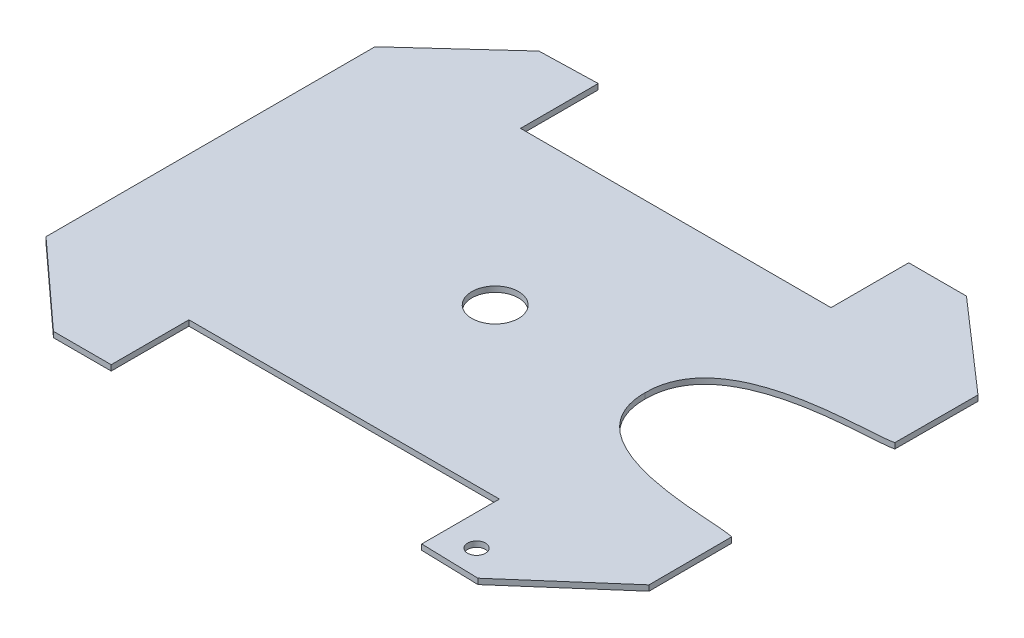
ISO-10303-21;
HEADER;
FILE_DESCRIPTION(('STEP AP214'),'2;1');
FILE_NAME('part.step','',(''),(''),'','','');
FILE_SCHEMA(('AUTOMOTIVE_DESIGN { 1 0 10303 214 1 1 1 1 }'));
ENDSEC;
DATA;
#1=APPLICATION_CONTEXT('core data for automotive mechanical design processes');
#2=APPLICATION_PROTOCOL_DEFINITION('international standard','automotive_design',2000,#1);
#3=PRODUCT_CONTEXT('',#1,'mechanical');
#4=PRODUCT('Part','Part','',(#3));
#5=PRODUCT_RELATED_PRODUCT_CATEGORY('part','',(#4));
#6=PRODUCT_DEFINITION_FORMATION('','',#4);
#7=PRODUCT_DEFINITION_CONTEXT('part definition',#1,'design');
#8=PRODUCT_DEFINITION('design','',#6,#7);
#9=PRODUCT_DEFINITION_SHAPE('','',#8);
#10=(LENGTH_UNIT() NAMED_UNIT(*) SI_UNIT(.MILLI.,.METRE.));
#11=(NAMED_UNIT(*) PLANE_ANGLE_UNIT() SI_UNIT($,.RADIAN.));
#12=(NAMED_UNIT(*) SI_UNIT($,.STERADIAN.) SOLID_ANGLE_UNIT());
#13=UNCERTAINTY_MEASURE_WITH_UNIT(LENGTH_MEASURE(1.E-05),#10,'distance_accuracy_value','');
#14=(GEOMETRIC_REPRESENTATION_CONTEXT(3) GLOBAL_UNCERTAINTY_ASSIGNED_CONTEXT((#13)) GLOBAL_UNIT_ASSIGNED_CONTEXT((#10,
#11,#12)) REPRESENTATION_CONTEXT('',''));
#15=CARTESIAN_POINT('',(0.,0.,0.));
#16=DIRECTION('',(0.,0.,1.));
#17=DIRECTION('',(1.,0.,0.));
#18=AXIS2_PLACEMENT_3D('',#15,#16,#17);
#19=CARTESIAN_POINT('',(273.101729513809,5.,148.382005757265));
#20=CARTESIAN_POINT('',(253.05619370493,5.,142.743081174435));
#21=CARTESIAN_POINT('',(121.230792792244,5.,151.614484767043));
#22=CARTESIAN_POINT('',(121.662419816864,5.,74.8747182026434));
#23=B_SPLINE_CURVE_WITH_KNOTS('',3,(#19,#20,#21,#22),.UNSPECIFIED.,.F.,.F.,(4,4),(0.,1.),.UNSPECIFIED.);
#24=DIRECTION('',(0.,-1.,0.));
#25=VECTOR('',#24,1.);
#26=SURFACE_OF_LINEAR_EXTRUSION('',#23,#25);
#27=CARTESIAN_POINT('',(273.101729513809,0.,148.382005757265));
#28=CARTESIAN_POINT('',(253.05619370493,0.,142.743081174435));
#29=CARTESIAN_POINT('',(121.230792792244,0.,151.614484767043));
#30=CARTESIAN_POINT('',(121.662419816864,0.,74.8747182026434));
#31=B_SPLINE_CURVE_WITH_KNOTS('',3,(#27,#28,#29,#30),.UNSPECIFIED.,.F.,.F.,(4,4),(0.,1.),.UNSPECIFIED.);
#32=CARTESIAN_POINT('',(273.101729513809,0.,148.382005757266));
#33=VERTEX_POINT('',#32);
#34=CARTESIAN_POINT('',(121.662419816864,0.,74.8747182026438));
#35=VERTEX_POINT('',#34);
#36=EDGE_CURVE('E196',#33,#35,#31,.T.);
#37=ORIENTED_EDGE('',*,*,#36,.T.);
#38=DIRECTION('',(0.,-1.,0.));
#39=VECTOR('',#38,1.);
#40=CARTESIAN_POINT('',(121.662419816864,5.,74.8747182026438));
#41=LINE('',#40,#39);
#42=CARTESIAN_POINT('',(121.662419816864,5.,74.8747182026438));
#43=VERTEX_POINT('',#42);
#44=EDGE_CURVE('E11',#43,#35,#41,.T.);
#45=ORIENTED_EDGE('',*,*,#44,.F.);
#46=CARTESIAN_POINT('',(273.101729513809,5.,148.382005757266));
#47=VERTEX_POINT('',#46);
#48=EDGE_CURVE('E243',#47,#43,#23,.T.);
#49=ORIENTED_EDGE('',*,*,#48,.F.);
#50=DIRECTION('',(0.,-1.,0.));
#51=VECTOR('',#50,1.);
#52=CARTESIAN_POINT('',(273.101729513809,5.,148.382005757266));
#53=LINE('',#52,#51);
#54=EDGE_CURVE('E192',#47,#33,#53,.T.);
#55=ORIENTED_EDGE('',*,*,#54,.T.);
#56=EDGE_LOOP('',(#37,#45,#49,#55));
#57=FACE_BOUND('',#56,.T.);
#58=ADVANCED_FACE('F33',(#57),#26,.F.);
#59=CARTESIAN_POINT('',(121.662419816864,5.,74.8747182026438));
#60=CARTESIAN_POINT('',(121.230792792244,5.,-1.86504836175567));
#61=CARTESIAN_POINT('',(253.05619370493,5.,7.00635523085229));
#62=CARTESIAN_POINT('',(273.101729513809,5.,1.36743064802208));
#63=B_SPLINE_CURVE_WITH_KNOTS('',3,(#59,#60,#61,#62),.UNSPECIFIED.,.F.,.F.,(4,4),(0.,1.),.UNSPECIFIED.);
#64=DIRECTION('',(0.,-1.,0.));
#65=VECTOR('',#64,1.);
#66=SURFACE_OF_LINEAR_EXTRUSION('',#63,#65);
#67=CARTESIAN_POINT('',(121.662419816864,0.,74.8747182026438));
#68=CARTESIAN_POINT('',(121.230792792244,0.,-1.86504836175567));
#69=CARTESIAN_POINT('',(253.05619370493,0.,7.00635523085229));
#70=CARTESIAN_POINT('',(273.101729513809,0.,1.36743064802208));
#71=B_SPLINE_CURVE_WITH_KNOTS('',3,(#67,#68,#69,#70),.UNSPECIFIED.,.F.,.F.,(4,4),(0.,1.),.UNSPECIFIED.);
#72=CARTESIAN_POINT('',(273.101729513809,0.,1.36743064802208));
#73=VERTEX_POINT('',#72);
#74=EDGE_CURVE('E201',#35,#73,#71,.T.);
#75=ORIENTED_EDGE('',*,*,#74,.T.);
#76=DIRECTION('',(0.,-1.,0.));
#77=VECTOR('',#76,1.);
#78=CARTESIAN_POINT('',(273.101729513809,5.,1.36743064802208));
#79=LINE('',#78,#77);
#80=CARTESIAN_POINT('',(273.101729513809,5.,1.36743064802208));
#81=VERTEX_POINT('',#80);
#82=EDGE_CURVE('E42',#81,#73,#79,.T.);
#83=ORIENTED_EDGE('',*,*,#82,.F.);
#84=EDGE_CURVE('E126',#43,#81,#63,.T.);
#85=ORIENTED_EDGE('',*,*,#84,.F.);
#86=ORIENTED_EDGE('',*,*,#44,.T.);
#87=EDGE_LOOP('',(#75,#83,#85,#86));
#88=FACE_BOUND('',#87,.T.);
#89=ADVANCED_FACE('F357',(#88),#66,.F.);
#90=CARTESIAN_POINT('',(273.341577688739,5.,-73.2625755728206));
#91=DIRECTION('',(-0.999994835687422,0.,-0.0032138136980613));
#92=DIRECTION('',(-0.0032138136980613,0.,0.999994835687422));
#93=AXIS2_PLACEMENT_3D('',#90,#91,#92);
#94=PLANE('',#93);
#95=DIRECTION('',(0.0032138136980613,0.,-0.999994835687422));
#96=VECTOR('',#95,1.);
#97=CARTESIAN_POINT('',(273.341577688739,0.,-73.2625755728206));
#98=LINE('',#97,#96);
#99=CARTESIAN_POINT('',(273.341577688739,0.,-73.2625755728206));
#100=VERTEX_POINT('',#99);
#101=EDGE_CURVE('E209',#73,#100,#98,.T.);
#102=ORIENTED_EDGE('',*,*,#101,.T.);
#103=DIRECTION('',(0.,-1.,0.));
#104=VECTOR('',#103,1.);
#105=CARTESIAN_POINT('',(273.341577688739,5.,-73.2625755728206));
#106=LINE('',#105,#104);
#107=CARTESIAN_POINT('',(273.341577688739,5.,-73.2625755728206));
#108=VERTEX_POINT('',#107);
#109=EDGE_CURVE('E283',#108,#100,#106,.T.);
#110=ORIENTED_EDGE('',*,*,#109,.F.);
#111=DIRECTION('',(0.0032138136980613,0.,-0.999994835687422));
#112=VECTOR('',#111,1.);
#113=CARTESIAN_POINT('',(273.341577688739,5.,-73.2625755728206));
#114=LINE('',#113,#112);
#115=EDGE_CURVE('E291',#81,#108,#114,.T.);
#116=ORIENTED_EDGE('',*,*,#115,.F.);
#117=ORIENTED_EDGE('',*,*,#82,.T.);
#118=EDGE_LOOP('',(#102,#110,#116,#117));
#119=FACE_BOUND('',#118,.T.);
#120=ADVANCED_FACE('F289',(#119),#94,.F.);
#121=CARTESIAN_POINT('',(273.341577688739,5.,-73.2625755728206));
#122=DIRECTION('',(-0.657933153115814,0.,0.753076334796867));
#123=DIRECTION('',(0.753076334796867,0.,0.657933153115814));
#124=AXIS2_PLACEMENT_3D('',#121,#122,#123);
#125=PLANE('',#124);
#126=DIRECTION('',(-0.753076334796867,0.,-0.657933153115814));
#127=VECTOR('',#126,1.);
#128=CARTESIAN_POINT('',(273.341577688739,0.,-73.2625755728206));
#129=LINE('',#128,#127);
#130=CARTESIAN_POINT('',(191.068300868454,0.,-145.141499307877));
#131=VERTEX_POINT('',#130);
#132=EDGE_CURVE('E214',#100,#131,#129,.T.);
#133=ORIENTED_EDGE('',*,*,#132,.T.);
#134=DIRECTION('',(0.,-1.,0.));
#135=VECTOR('',#134,1.);
#136=CARTESIAN_POINT('',(191.068300868454,5.,-145.141499307877));
#137=LINE('',#136,#135);
#138=CARTESIAN_POINT('',(191.068300868454,5.,-145.141499307877));
#139=VERTEX_POINT('',#138);
#140=EDGE_CURVE('E280',#139,#131,#137,.T.);
#141=ORIENTED_EDGE('',*,*,#140,.F.);
#142=DIRECTION('',(-0.753076334796867,0.,-0.657933153115814));
#143=VECTOR('',#142,1.);
#144=CARTESIAN_POINT('',(273.341577688739,5.,-73.2625755728206));
#145=LINE('',#144,#143);
#146=EDGE_CURVE('E309',#108,#139,#145,.T.);
#147=ORIENTED_EDGE('',*,*,#146,.F.);
#148=ORIENTED_EDGE('',*,*,#109,.T.);
#149=EDGE_LOOP('',(#133,#141,#147,#148));
#150=FACE_BOUND('',#149,.T.);
#151=ADVANCED_FACE('F300',(#150),#125,.F.);
#152=CARTESIAN_POINT('',(139.068300868454,5.,-145.141499307877));
#153=DIRECTION('',(0.,0.,1.));
#154=DIRECTION('',(1.,0.,0.));
#155=AXIS2_PLACEMENT_3D('',#152,#153,#154);
#156=PLANE('',#155);
#157=DIRECTION('',(-1.,0.,0.));
#158=VECTOR('',#157,1.);
#159=CARTESIAN_POINT('',(139.068300868454,0.,-145.141499307877));
#160=LINE('',#159,#158);
#161=CARTESIAN_POINT('',(139.068300868454,0.,-145.141499307877));
#162=VERTEX_POINT('',#161);
#163=EDGE_CURVE('E216',#131,#162,#160,.T.);
#164=ORIENTED_EDGE('',*,*,#163,.T.);
#165=DIRECTION('',(0.,-1.,0.));
#166=VECTOR('',#165,1.);
#167=CARTESIAN_POINT('',(139.068300868454,5.,-145.141499307877));
#168=LINE('',#167,#166);
#169=CARTESIAN_POINT('',(139.068300868454,5.,-145.141499307877));
#170=VERTEX_POINT('',#169);
#171=EDGE_CURVE('E277',#170,#162,#168,.T.);
#172=ORIENTED_EDGE('',*,*,#171,.F.);
#173=DIRECTION('',(-1.,0.,0.));
#174=VECTOR('',#173,1.);
#175=CARTESIAN_POINT('',(139.068300868454,5.,-145.141499307877));
#176=LINE('',#175,#174);
#177=EDGE_CURVE('E306',#139,#170,#176,.T.);
#178=ORIENTED_EDGE('',*,*,#177,.F.);
#179=ORIENTED_EDGE('',*,*,#140,.T.);
#180=EDGE_LOOP('',(#164,#172,#178,#179));
#181=FACE_BOUND('',#180,.T.);
#182=ADVANCED_FACE('F304',(#181),#156,.F.);
#183=CARTESIAN_POINT('',(139.068300868454,5.,-75.1414993078773));
#184=DIRECTION('',(1.,0.,0.));
#185=DIRECTION('',(0.,0.,-1.));
#186=AXIS2_PLACEMENT_3D('',#183,#184,#185);
#187=PLANE('',#186);
#188=DIRECTION('',(0.,0.,1.));
#189=VECTOR('',#188,1.);
#190=CARTESIAN_POINT('',(139.068300868454,0.,-75.1414993078773));
#191=LINE('',#190,#189);
#192=CARTESIAN_POINT('',(139.068300868454,0.,-75.1414993078773));
#193=VERTEX_POINT('',#192);
#194=EDGE_CURVE('E218',#162,#193,#191,.T.);
#195=ORIENTED_EDGE('',*,*,#194,.T.);
#196=DIRECTION('',(0.,-1.,0.));
#197=VECTOR('',#196,1.);
#198=CARTESIAN_POINT('',(139.068300868454,5.,-75.1414993078773));
#199=LINE('',#198,#197);
#200=CARTESIAN_POINT('',(139.068300868454,5.,-75.1414993078773));
#201=VERTEX_POINT('',#200);
#202=EDGE_CURVE('E274',#201,#193,#199,.T.);
#203=ORIENTED_EDGE('',*,*,#202,.F.);
#204=DIRECTION('',(0.,0.,1.));
#205=VECTOR('',#204,1.);
#206=CARTESIAN_POINT('',(139.068300868454,5.,-75.1414993078773));
#207=LINE('',#206,#205);
#208=EDGE_CURVE('E308',#170,#201,#207,.T.);
#209=ORIENTED_EDGE('',*,*,#208,.F.);
#210=ORIENTED_EDGE('',*,*,#171,.T.);
#211=EDGE_LOOP('',(#195,#203,#209,#210));
#212=FACE_BOUND('',#211,.T.);
#213=ADVANCED_FACE('F536',(#212),#187,.F.);
#214=CARTESIAN_POINT('',(-140.586469874335,5.,-75.1414993078773));
#215=DIRECTION('',(0.,0.,1.));
#216=DIRECTION('',(1.,0.,0.));
#217=AXIS2_PLACEMENT_3D('',#214,#215,#216);
#218=PLANE('',#217);
#219=DIRECTION('',(-1.,0.,0.));
#220=VECTOR('',#219,1.);
#221=CARTESIAN_POINT('',(-140.586469874335,0.,-75.1414993078773));
#222=LINE('',#221,#220);
#223=CARTESIAN_POINT('',(-140.586469874335,0.,-75.1414993078773));
#224=VERTEX_POINT('',#223);
#225=EDGE_CURVE('E220',#193,#224,#222,.T.);
#226=ORIENTED_EDGE('',*,*,#225,.T.);
#227=DIRECTION('',(0.,-1.,0.));
#228=VECTOR('',#227,1.);
#229=CARTESIAN_POINT('',(-140.586469874335,5.,-75.1414993078773));
#230=LINE('',#229,#228);
#231=CARTESIAN_POINT('',(-140.586469874335,5.,-75.1414993078773));
#232=VERTEX_POINT('',#231);
#233=EDGE_CURVE('E271',#232,#224,#230,.T.);
#234=ORIENTED_EDGE('',*,*,#233,.F.);
#235=DIRECTION('',(-1.,0.,0.));
#236=VECTOR('',#235,1.);
#237=CARTESIAN_POINT('',(-140.586469874335,5.,-75.1414993078773));
#238=LINE('',#237,#236);
#239=EDGE_CURVE('E311',#201,#232,#238,.T.);
#240=ORIENTED_EDGE('',*,*,#239,.F.);
#241=ORIENTED_EDGE('',*,*,#202,.T.);
#242=EDGE_LOOP('',(#226,#234,#240,#241));
#243=FACE_BOUND('',#242,.T.);
#244=ADVANCED_FACE('F526',(#243),#218,.F.);
#245=CARTESIAN_POINT('',(-140.586469874335,5.,-75.1414993078773));
#246=DIRECTION('',(-1.,0.,0.));
#247=DIRECTION('',(0.,0.,1.));
#248=AXIS2_PLACEMENT_3D('',#245,#246,#247);
#249=PLANE('',#248);
#250=DIRECTION('',(0.,0.,-1.));
#251=VECTOR('',#250,1.);
#252=CARTESIAN_POINT('',(-140.586469874335,0.,-75.1414993078773));
#253=LINE('',#252,#251);
#254=CARTESIAN_POINT('',(-140.586469874335,0.,-145.141499307877));
#255=VERTEX_POINT('',#254);
#256=EDGE_CURVE('E222',#224,#255,#253,.T.);
#257=ORIENTED_EDGE('',*,*,#256,.T.);
#258=DIRECTION('',(0.,-1.,0.));
#259=VECTOR('',#258,1.);
#260=CARTESIAN_POINT('',(-140.586469874335,5.,-145.141499307877));
#261=LINE('',#260,#259);
#262=CARTESIAN_POINT('',(-140.586469874335,5.,-145.141499307877));
#263=VERTEX_POINT('',#262);
#264=EDGE_CURVE('E268',#263,#255,#261,.T.);
#265=ORIENTED_EDGE('',*,*,#264,.F.);
#266=DIRECTION('',(0.,0.,-1.));
#267=VECTOR('',#266,1.);
#268=CARTESIAN_POINT('',(-140.586469874335,5.,-75.1414993078773));
#269=LINE('',#268,#267);
#270=EDGE_CURVE('E317',#232,#263,#269,.T.);
#271=ORIENTED_EDGE('',*,*,#270,.F.);
#272=ORIENTED_EDGE('',*,*,#233,.T.);
#273=EDGE_LOOP('',(#257,#265,#271,#272));
#274=FACE_BOUND('',#273,.T.);
#275=ADVANCED_FACE('F516',(#274),#249,.F.);
#276=CARTESIAN_POINT('',(-140.586469874335,5.,-145.141499307877));
#277=DIRECTION('',(0.026876926913342,0.,0.99963875014912));
#278=DIRECTION('',(0.99963875014912,0.,-0.026876926913342));
#279=AXIS2_PLACEMENT_3D('',#276,#277,#278);
#280=PLANE('',#279);
#281=DIRECTION('',(-0.99963875014912,0.,0.0268769269133419));
#282=VECTOR('',#281,1.);
#283=CARTESIAN_POINT('',(-140.586469874335,0.,-145.141499307877));
#284=LINE('',#283,#282);
#285=CARTESIAN_POINT('',(-192.586469874335,0.,-143.743394043065));
#286=VERTEX_POINT('',#285);
#287=EDGE_CURVE('E224',#255,#286,#284,.T.);
#288=ORIENTED_EDGE('',*,*,#287,.T.);
#289=DIRECTION('',(0.,-1.,0.));
#290=VECTOR('',#289,1.);
#291=CARTESIAN_POINT('',(-192.586469874335,5.,-143.743394043065));
#292=LINE('',#291,#290);
#293=CARTESIAN_POINT('',(-192.586469874335,5.,-143.743394043065));
#294=VERTEX_POINT('',#293);
#295=EDGE_CURVE('E265',#294,#286,#292,.T.);
#296=ORIENTED_EDGE('',*,*,#295,.F.);
#297=DIRECTION('',(-0.99963875014912,0.,0.0268769269133419));
#298=VECTOR('',#297,1.);
#299=CARTESIAN_POINT('',(-140.586469874335,5.,-145.141499307877));
#300=LINE('',#299,#298);
#301=EDGE_CURVE('E319',#263,#294,#300,.T.);
#302=ORIENTED_EDGE('',*,*,#301,.F.);
#303=ORIENTED_EDGE('',*,*,#264,.T.);
#304=EDGE_LOOP('',(#288,#296,#302,#303));
#305=FACE_BOUND('',#304,.T.);
#306=ADVANCED_FACE('F506',(#305),#280,.F.);
#307=CARTESIAN_POINT('',(-269.792181600452,5.,-73.2625755728205));
#308=DIRECTION('',(0.674210134413066,0.,0.738539568780655));
#309=DIRECTION('',(0.738539568780655,0.,-0.674210134413066));
#310=AXIS2_PLACEMENT_3D('',#307,#308,#309);
#311=PLANE('',#310);
#312=DIRECTION('',(-0.738539568780655,0.,0.674210134413066));
#313=VECTOR('',#312,1.);
#314=CARTESIAN_POINT('',(-269.792181600452,0.,-73.2625755728205));
#315=LINE('',#314,#313);
#316=CARTESIAN_POINT('',(-269.792181600452,0.,-73.2625755728205));
#317=VERTEX_POINT('',#316);
#318=EDGE_CURVE('E226',#286,#317,#315,.T.);
#319=ORIENTED_EDGE('',*,*,#318,.T.);
#320=DIRECTION('',(0.,-1.,0.));
#321=VECTOR('',#320,1.);
#322=CARTESIAN_POINT('',(-269.792181600452,5.,-73.2625755728205));
#323=LINE('',#322,#321);
#324=CARTESIAN_POINT('',(-269.792181600452,5.,-73.2625755728205));
#325=VERTEX_POINT('',#324);
#326=EDGE_CURVE('E262',#325,#317,#323,.T.);
#327=ORIENTED_EDGE('',*,*,#326,.F.);
#328=DIRECTION('',(-0.738539568780655,0.,0.674210134413066));
#329=VECTOR('',#328,1.);
#330=CARTESIAN_POINT('',(-269.792181600452,5.,-73.2625755728205));
#331=LINE('',#330,#329);
#332=EDGE_CURVE('E321',#294,#325,#331,.T.);
#333=ORIENTED_EDGE('',*,*,#332,.F.);
#334=ORIENTED_EDGE('',*,*,#295,.T.);
#335=EDGE_LOOP('',(#319,#327,#333,#334));
#336=FACE_BOUND('',#335,.T.);
#337=ADVANCED_FACE('F496',(#336),#311,.F.);
#338=CARTESIAN_POINT('',(-269.792181600452,5.,-73.2625755728205));
#339=DIRECTION('',(1.,0.,0.));
#340=DIRECTION('',(0.,0.,-1.));
#341=AXIS2_PLACEMENT_3D('',#338,#339,#340);
#342=PLANE('',#341);
#343=DIRECTION('',(0.,0.,1.));
#344=VECTOR('',#343,1.);
#345=CARTESIAN_POINT('',(-269.792181600452,0.,-73.2625755728205));
#346=LINE('',#345,#344);
#347=CARTESIAN_POINT('',(-269.792181600452,0.,223.012011978108));
#348=VERTEX_POINT('',#347);
#349=EDGE_CURVE('E228',#317,#348,#346,.T.);
#350=ORIENTED_EDGE('',*,*,#349,.T.);
#351=DIRECTION('',(0.,-1.,0.));
#352=VECTOR('',#351,1.);
#353=CARTESIAN_POINT('',(-269.792181600452,5.,223.012011978108));
#354=LINE('',#353,#352);
#355=CARTESIAN_POINT('',(-269.792181600452,5.,223.012011978108));
#356=VERTEX_POINT('',#355);
#357=EDGE_CURVE('E259',#356,#348,#354,.T.);
#358=ORIENTED_EDGE('',*,*,#357,.F.);
#359=DIRECTION('',(0.,0.,1.));
#360=VECTOR('',#359,1.);
#361=CARTESIAN_POINT('',(-269.792181600452,5.,-73.2625755728205));
#362=LINE('',#361,#360);
#363=EDGE_CURVE('E323',#325,#356,#362,.T.);
#364=ORIENTED_EDGE('',*,*,#363,.F.);
#365=ORIENTED_EDGE('',*,*,#326,.T.);
#366=EDGE_LOOP('',(#350,#358,#364,#365));
#367=FACE_BOUND('',#366,.T.);
#368=ADVANCED_FACE('F486',(#367),#342,.F.);
#369=CARTESIAN_POINT('',(-269.792181600452,5.,223.012011978108));
#370=DIRECTION('',(0.674210134413065,0.,-0.738539568780655));
#371=DIRECTION('',(-0.738539568780655,0.,-0.674210134413065));
#372=AXIS2_PLACEMENT_3D('',#369,#370,#371);
#373=PLANE('',#372);
#374=DIRECTION('',(0.738539568780655,0.,0.674210134413065));
#375=VECTOR('',#374,1.);
#376=CARTESIAN_POINT('',(-269.792181600452,0.,223.012011978108));
#377=LINE('',#376,#375);
#378=CARTESIAN_POINT('',(-192.586469874335,0.,293.492830448352));
#379=VERTEX_POINT('',#378);
#380=EDGE_CURVE('E230',#348,#379,#377,.T.);
#381=ORIENTED_EDGE('',*,*,#380,.T.);
#382=DIRECTION('',(0.,-1.,0.));
#383=VECTOR('',#382,1.);
#384=CARTESIAN_POINT('',(-192.586469874335,5.,293.492830448352));
#385=LINE('',#384,#383);
#386=CARTESIAN_POINT('',(-192.586469874335,5.,293.492830448352));
#387=VERTEX_POINT('',#386);
#388=EDGE_CURVE('E256',#387,#379,#385,.T.);
#389=ORIENTED_EDGE('',*,*,#388,.F.);
#390=DIRECTION('',(0.738539568780655,0.,0.674210134413065));
#391=VECTOR('',#390,1.);
#392=CARTESIAN_POINT('',(-269.792181600452,5.,223.012011978108));
#393=LINE('',#392,#391);
#394=EDGE_CURVE('E325',#356,#387,#393,.T.);
#395=ORIENTED_EDGE('',*,*,#394,.F.);
#396=ORIENTED_EDGE('',*,*,#357,.T.);
#397=EDGE_LOOP('',(#381,#389,#395,#396));
#398=FACE_BOUND('',#397,.T.);
#399=ADVANCED_FACE('F476',(#398),#373,.F.);
#400=CARTESIAN_POINT('',(-140.586469874335,5.,293.492830448352));
#401=DIRECTION('',(0.,0.,-1.));
#402=DIRECTION('',(-1.,0.,0.));
#403=AXIS2_PLACEMENT_3D('',#400,#401,#402);
#404=PLANE('',#403);
#405=DIRECTION('',(1.,0.,0.));
#406=VECTOR('',#405,1.);
#407=CARTESIAN_POINT('',(-140.586469874335,0.,293.492830448352));
#408=LINE('',#407,#406);
#409=CARTESIAN_POINT('',(-140.586469874335,0.,293.492830448352));
#410=VERTEX_POINT('',#409);
#411=EDGE_CURVE('E232',#379,#410,#408,.T.);
#412=ORIENTED_EDGE('',*,*,#411,.T.);
#413=DIRECTION('',(0.,-1.,0.));
#414=VECTOR('',#413,1.);
#415=CARTESIAN_POINT('',(-140.586469874335,5.,293.492830448352));
#416=LINE('',#415,#414);
#417=CARTESIAN_POINT('',(-140.586469874335,5.,293.492830448352));
#418=VERTEX_POINT('',#417);
#419=EDGE_CURVE('E253',#418,#410,#416,.T.);
#420=ORIENTED_EDGE('',*,*,#419,.F.);
#421=DIRECTION('',(1.,0.,0.));
#422=VECTOR('',#421,1.);
#423=CARTESIAN_POINT('',(-140.586469874335,5.,293.492830448352));
#424=LINE('',#423,#422);
#425=EDGE_CURVE('E327',#387,#418,#424,.T.);
#426=ORIENTED_EDGE('',*,*,#425,.F.);
#427=ORIENTED_EDGE('',*,*,#388,.T.);
#428=EDGE_LOOP('',(#412,#420,#426,#427));
#429=FACE_BOUND('',#428,.T.);
#430=ADVANCED_FACE('F466',(#429),#404,.F.);
#431=CARTESIAN_POINT('',(-140.586469874335,5.,223.492830448352));
#432=DIRECTION('',(-1.,0.,0.));
#433=DIRECTION('',(0.,0.,1.));
#434=AXIS2_PLACEMENT_3D('',#431,#432,#433);
#435=PLANE('',#434);
#436=DIRECTION('',(0.,0.,-1.));
#437=VECTOR('',#436,1.);
#438=CARTESIAN_POINT('',(-140.586469874335,0.,223.492830448352));
#439=LINE('',#438,#437);
#440=CARTESIAN_POINT('',(-140.586469874335,0.,223.492830448352));
#441=VERTEX_POINT('',#440);
#442=EDGE_CURVE('E234',#410,#441,#439,.T.);
#443=ORIENTED_EDGE('',*,*,#442,.T.);
#444=DIRECTION('',(0.,-1.,0.));
#445=VECTOR('',#444,1.);
#446=CARTESIAN_POINT('',(-140.586469874335,5.,223.492830448352));
#447=LINE('',#446,#445);
#448=CARTESIAN_POINT('',(-140.586469874335,5.,223.492830448352));
#449=VERTEX_POINT('',#448);
#450=EDGE_CURVE('E250',#449,#441,#447,.T.);
#451=ORIENTED_EDGE('',*,*,#450,.F.);
#452=DIRECTION('',(0.,0.,-1.));
#453=VECTOR('',#452,1.);
#454=CARTESIAN_POINT('',(-140.586469874335,5.,223.492830448352));
#455=LINE('',#454,#453);
#456=EDGE_CURVE('E329',#418,#449,#455,.T.);
#457=ORIENTED_EDGE('',*,*,#456,.F.);
#458=ORIENTED_EDGE('',*,*,#419,.T.);
#459=EDGE_LOOP('',(#443,#451,#457,#458));
#460=FACE_BOUND('',#459,.T.);
#461=ADVANCED_FACE('F457',(#460),#435,.F.);
#462=CARTESIAN_POINT('',(-140.586469874335,5.,223.492830448352));
#463=DIRECTION('',(0.,0.,-1.));
#464=DIRECTION('',(-1.,0.,0.));
#465=AXIS2_PLACEMENT_3D('',#462,#463,#464);
#466=PLANE('',#465);
#467=DIRECTION('',(1.,0.,0.));
#468=VECTOR('',#467,1.);
#469=CARTESIAN_POINT('',(-140.586469874335,0.,223.492830448352));
#470=LINE('',#469,#468);
#471=CARTESIAN_POINT('',(139.068300868454,0.,223.492830448352));
#472=VERTEX_POINT('',#471);
#473=EDGE_CURVE('E236',#441,#472,#470,.T.);
#474=ORIENTED_EDGE('',*,*,#473,.T.);
#475=DIRECTION('',(0.,-1.,0.));
#476=VECTOR('',#475,1.);
#477=CARTESIAN_POINT('',(139.068300868454,5.,223.492830448352));
#478=LINE('',#477,#476);
#479=CARTESIAN_POINT('',(139.068300868454,5.,223.492830448352));
#480=VERTEX_POINT('',#479);
#481=EDGE_CURVE('E247',#480,#472,#478,.T.);
#482=ORIENTED_EDGE('',*,*,#481,.F.);
#483=DIRECTION('',(1.,0.,0.));
#484=VECTOR('',#483,1.);
#485=CARTESIAN_POINT('',(-140.586469874335,5.,223.492830448352));
#486=LINE('',#485,#484);
#487=EDGE_CURVE('E331',#449,#480,#486,.T.);
#488=ORIENTED_EDGE('',*,*,#487,.F.);
#489=ORIENTED_EDGE('',*,*,#450,.T.);
#490=EDGE_LOOP('',(#474,#482,#488,#489));
#491=FACE_BOUND('',#490,.T.);
#492=ADVANCED_FACE('F337',(#491),#466,.F.);
#493=CARTESIAN_POINT('',(139.068300868454,5.,223.492830448352));
#494=DIRECTION('',(1.,0.,0.));
#495=DIRECTION('',(0.,0.,-1.));
#496=AXIS2_PLACEMENT_3D('',#493,#494,#495);
#497=PLANE('',#496);
#498=DIRECTION('',(0.,0.,1.));
#499=VECTOR('',#498,1.);
#500=CARTESIAN_POINT('',(139.068300868454,0.,223.492830448352));
#501=LINE('',#500,#499);
#502=CARTESIAN_POINT('',(139.068300868454,0.,293.492830448352));
#503=VERTEX_POINT('',#502);
#504=EDGE_CURVE('E238',#472,#503,#501,.T.);
#505=ORIENTED_EDGE('',*,*,#504,.T.);
#506=DIRECTION('',(0.,-1.,0.));
#507=VECTOR('',#506,1.);
#508=CARTESIAN_POINT('',(139.068300868454,5.,293.492830448352));
#509=LINE('',#508,#507);
#510=CARTESIAN_POINT('',(139.068300868454,5.,293.492830448352));
#511=VERTEX_POINT('',#510);
#512=EDGE_CURVE('E187',#511,#503,#509,.T.);
#513=ORIENTED_EDGE('',*,*,#512,.F.);
#514=DIRECTION('',(0.,0.,1.));
#515=VECTOR('',#514,1.);
#516=CARTESIAN_POINT('',(139.068300868454,5.,223.492830448352));
#517=LINE('',#516,#515);
#518=EDGE_CURVE('E178',#480,#511,#517,.T.);
#519=ORIENTED_EDGE('',*,*,#518,.F.);
#520=ORIENTED_EDGE('',*,*,#481,.T.);
#521=EDGE_LOOP('',(#505,#513,#519,#520));
#522=FACE_BOUND('',#521,.T.);
#523=ADVANCED_FACE('F341',(#522),#497,.F.);
#524=CARTESIAN_POINT('',(139.068300868454,5.,293.492830448352));
#525=DIRECTION('',(0.0268769269133441,0.,-0.99963875014912));
#526=DIRECTION('',(-0.99963875014912,0.,-0.0268769269133441));
#527=AXIS2_PLACEMENT_3D('',#524,#525,#526);
#528=PLANE('',#527);
#529=DIRECTION('',(0.99963875014912,0.,0.0268769269133441));
#530=VECTOR('',#529,1.);
#531=CARTESIAN_POINT('',(139.068300868454,0.,293.492830448352));
#532=LINE('',#531,#530);
#533=CARTESIAN_POINT('',(191.068300868454,0.,294.890935713164));
#534=VERTEX_POINT('',#533);
#535=EDGE_CURVE('E186',#503,#534,#532,.T.);
#536=ORIENTED_EDGE('',*,*,#535,.T.);
#537=DIRECTION('',(0.,-1.,0.));
#538=VECTOR('',#537,1.);
#539=CARTESIAN_POINT('',(191.068300868454,5.,294.890935713164));
#540=LINE('',#539,#538);
#541=CARTESIAN_POINT('',(191.068300868454,5.,294.890935713164));
#542=VERTEX_POINT('',#541);
#543=EDGE_CURVE('E183',#542,#534,#540,.T.);
#544=ORIENTED_EDGE('',*,*,#543,.F.);
#545=DIRECTION('',(0.99963875014912,0.,0.0268769269133441));
#546=VECTOR('',#545,1.);
#547=CARTESIAN_POINT('',(139.068300868454,5.,293.492830448352));
#548=LINE('',#547,#546);
#549=EDGE_CURVE('E172',#511,#542,#548,.T.);
#550=ORIENTED_EDGE('',*,*,#549,.F.);
#551=ORIENTED_EDGE('',*,*,#512,.T.);
#552=EDGE_LOOP('',(#536,#544,#550,#551));
#553=FACE_BOUND('',#552,.T.);
#554=ADVANCED_FACE('F184',(#553),#528,.F.);
#555=CARTESIAN_POINT('',(273.341577688739,5.,223.012011978108));
#556=DIRECTION('',(-0.657933153115814,0.,-0.753076334796867));
#557=DIRECTION('',(-0.753076334796867,0.,0.657933153115814));
#558=AXIS2_PLACEMENT_3D('',#555,#556,#557);
#559=PLANE('',#558);
#560=DIRECTION('',(0.753076334796867,0.,-0.657933153115814));
#561=VECTOR('',#560,1.);
#562=CARTESIAN_POINT('',(273.341577688739,0.,223.012011978108));
#563=LINE('',#562,#561);
#564=CARTESIAN_POINT('',(273.341577688739,0.,223.012011978108));
#565=VERTEX_POINT('',#564);
#566=EDGE_CURVE('E112',#534,#565,#563,.T.);
#567=ORIENTED_EDGE('',*,*,#566,.T.);
#568=DIRECTION('',(0.,-1.,0.));
#569=VECTOR('',#568,1.);
#570=CARTESIAN_POINT('',(273.341577688739,5.,223.012011978108));
#571=LINE('',#570,#569);
#572=CARTESIAN_POINT('',(273.341577688739,5.,223.012011978108));
#573=VERTEX_POINT('',#572);
#574=EDGE_CURVE('E188',#573,#565,#571,.T.);
#575=ORIENTED_EDGE('',*,*,#574,.F.);
#576=DIRECTION('',(0.753076334796867,0.,-0.657933153115814));
#577=VECTOR('',#576,1.);
#578=CARTESIAN_POINT('',(273.341577688739,5.,223.012011978108));
#579=LINE('',#578,#577);
#580=EDGE_CURVE('E176',#542,#573,#579,.T.);
#581=ORIENTED_EDGE('',*,*,#580,.F.);
#582=ORIENTED_EDGE('',*,*,#543,.T.);
#583=EDGE_LOOP('',(#567,#575,#581,#582));
#584=FACE_BOUND('',#583,.T.);
#585=ADVANCED_FACE('F190',(#584),#559,.F.);
#586=CARTESIAN_POINT('',(273.341577688739,5.,223.012011978108));
#587=DIRECTION('',(-0.999994835687422,0.,0.00321381369805613));
#588=DIRECTION('',(0.00321381369805613,0.,0.999994835687422));
#589=AXIS2_PLACEMENT_3D('',#586,#587,#588);
#590=PLANE('',#589);
#591=DIRECTION('',(-0.00321381369805613,0.,-0.999994835687422));
#592=VECTOR('',#591,1.);
#593=CARTESIAN_POINT('',(273.341577688739,0.,223.012011978108));
#594=LINE('',#593,#592);
#595=EDGE_CURVE('E118',#565,#33,#594,.T.);
#596=ORIENTED_EDGE('',*,*,#595,.T.);
#597=ORIENTED_EDGE('',*,*,#54,.F.);
#598=DIRECTION('',(-0.00321381369805613,0.,-0.999994835687422));
#599=VECTOR('',#598,1.);
#600=CARTESIAN_POINT('',(273.341577688739,5.,223.012011978108));
#601=LINE('',#600,#599);
#602=EDGE_CURVE('E50',#573,#47,#601,.T.);
#603=ORIENTED_EDGE('',*,*,#602,.F.);
#604=ORIENTED_EDGE('',*,*,#574,.T.);
#605=EDGE_LOOP('',(#596,#597,#603,#604));
#606=FACE_BOUND('',#605,.T.);
#607=ADVANCED_FACE('F345',(#606),#590,.F.);
#608=CARTESIAN_POINT('',(189.703138602774,5.,138.291177723043));
#609=DIRECTION('',(0.,-1.,0.));
#610=DIRECTION('',(0.,0.,-1.));
#611=AXIS2_PLACEMENT_3D('',#608,#609,#610);
#612=PLANE('',#611);
#613=CARTESIAN_POINT('',(167.052967515773,5.,272.065876513803));
#614=DIRECTION('',(0.,1.,0.));
#615=DIRECTION('',(0.,0.,1.));
#616=AXIS2_PLACEMENT_3D('',#613,#614,#615);
#617=CIRCLE('',#616,8.00000000000001);
#618=CARTESIAN_POINT('',(167.052967515773,5.,280.065876513803));
#619=VERTEX_POINT('',#618);
#620=EDGE_CURVE('E386',#619,#619,#617,.T.);
#621=ORIENTED_EDGE('',*,*,#620,.F.);
#622=EDGE_LOOP('',(#621));
#623=FACE_BOUND('',#622,.T.);
#624=CARTESIAN_POINT('',(-14.2299509116979,5.,74.0266572541699));
#625=DIRECTION('',(0.,1.,0.));
#626=DIRECTION('',(0.,0.,1.));
#627=AXIS2_PLACEMENT_3D('',#624,#625,#626);
#628=CIRCLE('',#627,21.);
#629=CARTESIAN_POINT('',(-14.2299509116979,5.,95.0266572541699));
#630=VERTEX_POINT('',#629);
#631=EDGE_CURVE('E377',#630,#630,#628,.T.);
#632=ORIENTED_EDGE('',*,*,#631,.F.);
#633=EDGE_LOOP('',(#632));
#634=FACE_BOUND('',#633,.T.);
#635=ORIENTED_EDGE('',*,*,#48,.T.);
#636=ORIENTED_EDGE('',*,*,#84,.T.);
#637=ORIENTED_EDGE('',*,*,#115,.T.);
#638=ORIENTED_EDGE('',*,*,#146,.T.);
#639=ORIENTED_EDGE('',*,*,#177,.T.);
#640=ORIENTED_EDGE('',*,*,#208,.T.);
#641=ORIENTED_EDGE('',*,*,#239,.T.);
#642=ORIENTED_EDGE('',*,*,#270,.T.);
#643=ORIENTED_EDGE('',*,*,#301,.T.);
#644=ORIENTED_EDGE('',*,*,#332,.T.);
#645=ORIENTED_EDGE('',*,*,#363,.T.);
#646=ORIENTED_EDGE('',*,*,#394,.T.);
#647=ORIENTED_EDGE('',*,*,#425,.T.);
#648=ORIENTED_EDGE('',*,*,#456,.T.);
#649=ORIENTED_EDGE('',*,*,#487,.T.);
#650=ORIENTED_EDGE('',*,*,#518,.T.);
#651=ORIENTED_EDGE('',*,*,#549,.T.);
#652=ORIENTED_EDGE('',*,*,#580,.T.);
#653=ORIENTED_EDGE('',*,*,#602,.T.);
#654=EDGE_LOOP('',(#635,#636,#637,#638,#639,#640,#641,#642,#643,#644,#645,#646,#647,#648,#649,
#650,#651,#652,#653));
#655=FACE_BOUND('',#654,.T.);
#656=ADVANCED_FACE('F174',(#623,#634,#655),#612,.F.);
#657=CARTESIAN_POINT('',(189.703138602774,0.,138.291177723043));
#658=DIRECTION('',(0.,-1.,0.));
#659=DIRECTION('',(0.,0.,-1.));
#660=AXIS2_PLACEMENT_3D('',#657,#658,#659);
#661=PLANE('',#660);
#662=CARTESIAN_POINT('',(167.052967515773,0.,272.065876513803));
#663=DIRECTION('',(0.,1.,0.));
#664=DIRECTION('',(0.,0.,1.));
#665=AXIS2_PLACEMENT_3D('',#662,#663,#664);
#666=CIRCLE('',#665,8.00000000000001);
#667=CARTESIAN_POINT('',(167.052967515773,0.,280.065876513803));
#668=VERTEX_POINT('',#667);
#669=EDGE_CURVE('E383',#668,#668,#666,.T.);
#670=ORIENTED_EDGE('',*,*,#669,.T.);
#671=EDGE_LOOP('',(#670));
#672=FACE_BOUND('',#671,.T.);
#673=CARTESIAN_POINT('',(-14.2299509116979,0.,74.0266572541699));
#674=DIRECTION('',(0.,1.,0.));
#675=DIRECTION('',(0.,0.,1.));
#676=AXIS2_PLACEMENT_3D('',#673,#674,#675);
#677=CIRCLE('',#676,21.);
#678=CARTESIAN_POINT('',(-14.2299509116979,0.,95.0266572541699));
#679=VERTEX_POINT('',#678);
#680=EDGE_CURVE('E202',#679,#679,#677,.T.);
#681=ORIENTED_EDGE('',*,*,#680,.T.);
#682=EDGE_LOOP('',(#681));
#683=FACE_BOUND('',#682,.T.);
#684=ORIENTED_EDGE('',*,*,#36,.F.);
#685=ORIENTED_EDGE('',*,*,#595,.F.);
#686=ORIENTED_EDGE('',*,*,#566,.F.);
#687=ORIENTED_EDGE('',*,*,#535,.F.);
#688=ORIENTED_EDGE('',*,*,#504,.F.);
#689=ORIENTED_EDGE('',*,*,#473,.F.);
#690=ORIENTED_EDGE('',*,*,#442,.F.);
#691=ORIENTED_EDGE('',*,*,#411,.F.);
#692=ORIENTED_EDGE('',*,*,#380,.F.);
#693=ORIENTED_EDGE('',*,*,#349,.F.);
#694=ORIENTED_EDGE('',*,*,#318,.F.);
#695=ORIENTED_EDGE('',*,*,#287,.F.);
#696=ORIENTED_EDGE('',*,*,#256,.F.);
#697=ORIENTED_EDGE('',*,*,#225,.F.);
#698=ORIENTED_EDGE('',*,*,#194,.F.);
#699=ORIENTED_EDGE('',*,*,#163,.F.);
#700=ORIENTED_EDGE('',*,*,#132,.F.);
#701=ORIENTED_EDGE('',*,*,#101,.F.);
#702=ORIENTED_EDGE('',*,*,#74,.F.);
#703=EDGE_LOOP('',(#684,#685,#686,#687,#688,#689,#690,#691,#692,#693,#694,#695,#696,#697,#698,
#699,#700,#701,#702));
#704=FACE_BOUND('',#703,.T.);
#705=ADVANCED_FACE('F295',(#672,#683,#704),#661,.T.);
#706=CARTESIAN_POINT('',(-14.2299509116979,0.,74.0266572541699));
#707=DIRECTION('',(0.,1.,0.));
#708=DIRECTION('',(0.,0.,1.));
#709=AXIS2_PLACEMENT_3D('',#706,#707,#708);
#710=CYLINDRICAL_SURFACE('',#709,21.);
#711=ORIENTED_EDGE('',*,*,#680,.F.);
#712=EDGE_LOOP('',(#711));
#713=FACE_BOUND('',#712,.T.);
#714=ORIENTED_EDGE('',*,*,#631,.T.);
#715=EDGE_LOOP('',(#714));
#716=FACE_BOUND('',#715,.T.);
#717=ADVANCED_FACE('F397',(#713,#716),#710,.F.);
#718=CARTESIAN_POINT('',(167.052967515773,0.,272.065876513803));
#719=DIRECTION('',(0.,1.,0.));
#720=DIRECTION('',(0.,0.,1.));
#721=AXIS2_PLACEMENT_3D('',#718,#719,#720);
#722=CYLINDRICAL_SURFACE('',#721,8.00000000000001);
#723=ORIENTED_EDGE('',*,*,#669,.F.);
#724=EDGE_LOOP('',(#723));
#725=FACE_BOUND('',#724,.T.);
#726=ORIENTED_EDGE('',*,*,#620,.T.);
#727=EDGE_LOOP('',(#726));
#728=FACE_BOUND('',#727,.T.);
#729=ADVANCED_FACE('F394',(#725,#728),#722,.F.);
#730=CLOSED_SHELL('',(#58,#89,#120,#151,#182,#213,#244,#275,#306,#337,#368,#399,#430,#461,#492,
#523,#554,#585,#607,#656,#705,#717,#729));
#731=MANIFOLD_SOLID_BREP('B2',#730);
#732=ADVANCED_BREP_SHAPE_REPRESENTATION('',(#18,#731),#14);
#733=SHAPE_DEFINITION_REPRESENTATION(#9,#732);
ENDSEC;
END-ISO-10303-21;
